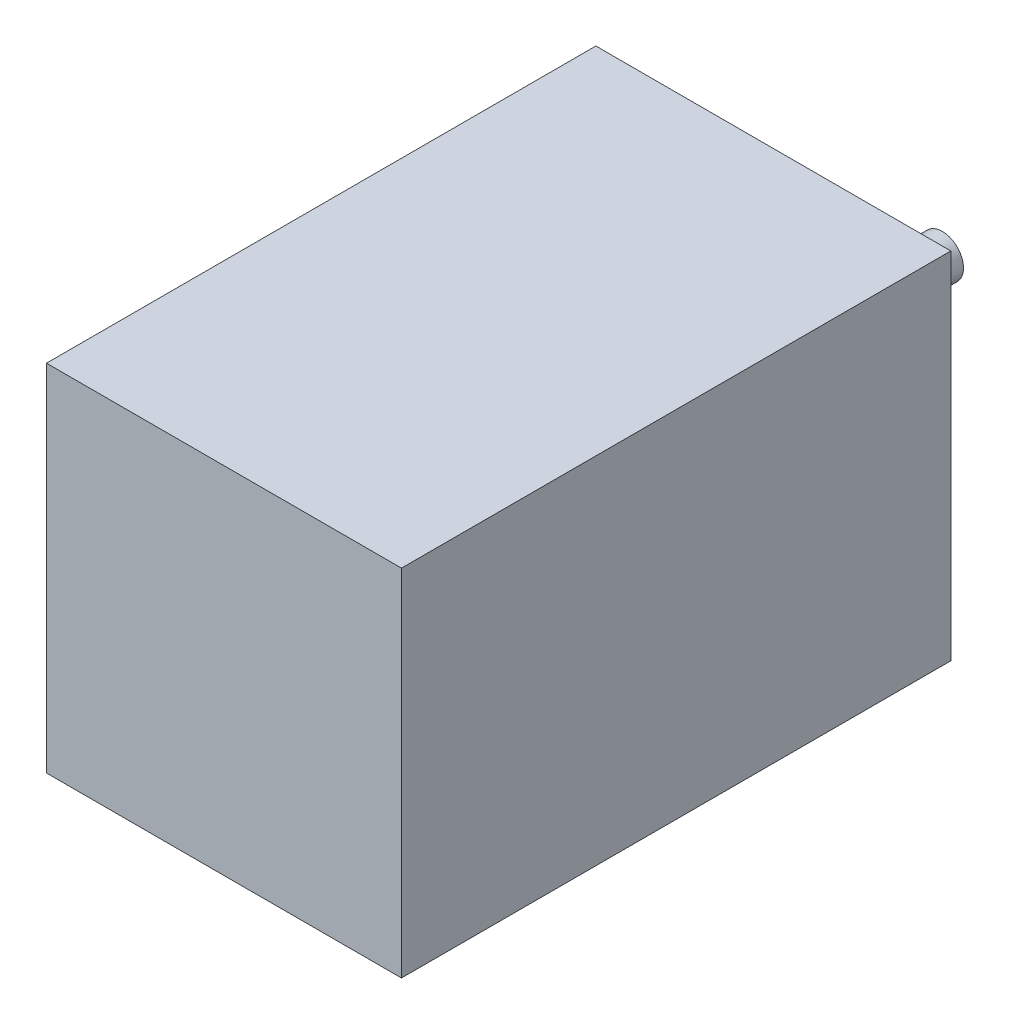
ISO-10303-21;
HEADER;
FILE_DESCRIPTION(('STEP AP214'),'2;1');
FILE_NAME('part.step','',(''),(''),'','','');
FILE_SCHEMA(('AUTOMOTIVE_DESIGN { 1 0 10303 214 1 1 1 1 }'));
ENDSEC;
DATA;
#1=APPLICATION_CONTEXT('core data for automotive mechanical design processes');
#2=APPLICATION_PROTOCOL_DEFINITION('international standard','automotive_design',2000,#1);
#3=PRODUCT_CONTEXT('',#1,'mechanical');
#4=PRODUCT('Part','Part','',(#3));
#5=PRODUCT_RELATED_PRODUCT_CATEGORY('part','',(#4));
#6=PRODUCT_DEFINITION_FORMATION('','',#4);
#7=PRODUCT_DEFINITION_CONTEXT('part definition',#1,'design');
#8=PRODUCT_DEFINITION('design','',#6,#7);
#9=PRODUCT_DEFINITION_SHAPE('','',#8);
#10=(LENGTH_UNIT() NAMED_UNIT(*) SI_UNIT(.MILLI.,.METRE.));
#11=(NAMED_UNIT(*) PLANE_ANGLE_UNIT() SI_UNIT($,.RADIAN.));
#12=(NAMED_UNIT(*) SI_UNIT($,.STERADIAN.) SOLID_ANGLE_UNIT());
#13=UNCERTAINTY_MEASURE_WITH_UNIT(LENGTH_MEASURE(1.E-05),#10,'distance_accuracy_value','');
#14=(GEOMETRIC_REPRESENTATION_CONTEXT(3) GLOBAL_UNCERTAINTY_ASSIGNED_CONTEXT((#13)) GLOBAL_UNIT_ASSIGNED_CONTEXT((#10,
#11,#12)) REPRESENTATION_CONTEXT('',''));
#15=CARTESIAN_POINT('',(0.,0.,0.));
#16=DIRECTION('',(0.,0.,1.));
#17=DIRECTION('',(1.,0.,0.));
#18=AXIS2_PLACEMENT_3D('',#15,#16,#17);
#19=CARTESIAN_POINT('',(0.,0.,-20.));
#20=DIRECTION('',(0.,0.,1.));
#21=DIRECTION('',(1.,0.,0.));
#22=AXIS2_PLACEMENT_3D('',#19,#20,#21);
#23=PLANE('',#22);
#24=CARTESIAN_POINT('',(0.,0.,-20.));
#25=DIRECTION('',(0.,0.,1.));
#26=DIRECTION('',(1.,0.,0.));
#27=AXIS2_PLACEMENT_3D('',#24,#25,#26);
#28=CIRCLE('',#27,2.5);
#29=CARTESIAN_POINT('',(2.5,0.,-20.));
#30=VERTEX_POINT('',#29);
#31=EDGE_CURVE('E10',#30,#30,#28,.T.);
#32=ORIENTED_EDGE('',*,*,#31,.F.);
#33=EDGE_LOOP('',(#32));
#34=FACE_BOUND('',#33,.T.);
#35=ADVANCED_FACE('F16',(#34),#23,.F.);
#36=CARTESIAN_POINT('',(0.,0.,-20.));
#37=DIRECTION('',(0.,0.,1.));
#38=DIRECTION('',(1.,0.,0.));
#39=AXIS2_PLACEMENT_3D('',#36,#37,#38);
#40=CYLINDRICAL_SURFACE('',#39,2.5);
#41=CARTESIAN_POINT('',(0.,0.,0.));
#42=DIRECTION('',(0.,0.,1.));
#43=DIRECTION('',(1.,0.,0.));
#44=AXIS2_PLACEMENT_3D('',#41,#42,#43);
#45=CIRCLE('',#44,2.5);
#46=CARTESIAN_POINT('',(2.5,0.,0.));
#47=VERTEX_POINT('',#46);
#48=EDGE_CURVE('E25',#47,#47,#45,.T.);
#49=ORIENTED_EDGE('',*,*,#48,.F.);
#50=EDGE_LOOP('',(#49));
#51=FACE_BOUND('',#50,.T.);
#52=ORIENTED_EDGE('',*,*,#31,.T.);
#53=EDGE_LOOP('',(#52));
#54=FACE_BOUND('',#53,.T.);
#55=ADVANCED_FACE('F18',(#51,#54),#40,.T.);
#56=CARTESIAN_POINT('',(21.,-21.,0.));
#57=DIRECTION('',(1.,0.,0.));
#58=DIRECTION('',(0.,1.,0.));
#59=AXIS2_PLACEMENT_3D('',#56,#57,#58);
#60=PLANE('',#59);
#61=DIRECTION('',(0.,0.,1.));
#62=VECTOR('',#61,1.);
#63=CARTESIAN_POINT('',(21.,-21.,0.));
#64=LINE('',#63,#62);
#65=CARTESIAN_POINT('',(21.,-21.,0.));
#66=VERTEX_POINT('',#65);
#67=CARTESIAN_POINT('',(21.,-21.,65.));
#68=VERTEX_POINT('',#67);
#69=EDGE_CURVE('E77',#66,#68,#64,.T.);
#70=ORIENTED_EDGE('',*,*,#69,.F.);
#71=DIRECTION('',(0.,1.,0.));
#72=VECTOR('',#71,1.);
#73=CARTESIAN_POINT('',(21.,-21.,0.));
#74=LINE('',#73,#72);
#75=CARTESIAN_POINT('',(21.,21.,0.));
#76=VERTEX_POINT('',#75);
#77=EDGE_CURVE('E37',#66,#76,#74,.T.);
#78=ORIENTED_EDGE('',*,*,#77,.T.);
#79=DIRECTION('',(0.,0.,1.));
#80=VECTOR('',#79,1.);
#81=CARTESIAN_POINT('',(21.,21.,0.));
#82=LINE('',#81,#80);
#83=CARTESIAN_POINT('',(21.,21.,65.));
#84=VERTEX_POINT('',#83);
#85=EDGE_CURVE('E43',#76,#84,#82,.T.);
#86=ORIENTED_EDGE('',*,*,#85,.T.);
#87=DIRECTION('',(0.,1.,0.));
#88=VECTOR('',#87,1.);
#89=CARTESIAN_POINT('',(21.,-21.,65.));
#90=LINE('',#89,#88);
#91=EDGE_CURVE('E112',#68,#84,#90,.T.);
#92=ORIENTED_EDGE('',*,*,#91,.F.);
#93=EDGE_LOOP('',(#70,#78,#86,#92));
#94=FACE_BOUND('',#93,.T.);
#95=ADVANCED_FACE('F131',(#94),#60,.T.);
#96=CARTESIAN_POINT('',(-21.,-21.,0.));
#97=DIRECTION('',(0.,0.,1.));
#98=DIRECTION('',(1.,0.,0.));
#99=AXIS2_PLACEMENT_3D('',#96,#97,#98);
#100=PLANE('',#99);
#101=ORIENTED_EDGE('',*,*,#48,.T.);
#102=EDGE_LOOP('',(#101));
#103=FACE_BOUND('',#102,.T.);
#104=DIRECTION('',(1.,0.,0.));
#105=VECTOR('',#104,1.);
#106=CARTESIAN_POINT('',(-21.,21.,0.));
#107=LINE('',#106,#105);
#108=CARTESIAN_POINT('',(-21.,21.,0.));
#109=VERTEX_POINT('',#108);
#110=EDGE_CURVE('E104',#109,#76,#107,.T.);
#111=ORIENTED_EDGE('',*,*,#110,.T.);
#112=ORIENTED_EDGE('',*,*,#77,.F.);
#113=DIRECTION('',(1.,0.,0.));
#114=VECTOR('',#113,1.);
#115=CARTESIAN_POINT('',(-21.,-21.,0.));
#116=LINE('',#115,#114);
#117=CARTESIAN_POINT('',(-21.,-21.,0.));
#118=VERTEX_POINT('',#117);
#119=EDGE_CURVE('E82',#118,#66,#116,.T.);
#120=ORIENTED_EDGE('',*,*,#119,.F.);
#121=DIRECTION('',(0.,1.,0.));
#122=VECTOR('',#121,1.);
#123=CARTESIAN_POINT('',(-21.,-21.,0.));
#124=LINE('',#123,#122);
#125=EDGE_CURVE('E90',#118,#109,#124,.T.);
#126=ORIENTED_EDGE('',*,*,#125,.T.);
#127=EDGE_LOOP('',(#111,#112,#120,#126));
#128=FACE_BOUND('',#127,.T.);
#129=ADVANCED_FACE('F126',(#103,#128),#100,.F.);
#130=CARTESIAN_POINT('',(-21.,21.,0.));
#131=DIRECTION('',(0.,1.,0.));
#132=DIRECTION('',(1.,0.,0.));
#133=AXIS2_PLACEMENT_3D('',#130,#131,#132);
#134=PLANE('',#133);
#135=ORIENTED_EDGE('',*,*,#110,.F.);
#136=DIRECTION('',(0.,0.,1.));
#137=VECTOR('',#136,1.);
#138=CARTESIAN_POINT('',(-21.,21.,0.));
#139=LINE('',#138,#137);
#140=CARTESIAN_POINT('',(-21.,21.,65.));
#141=VERTEX_POINT('',#140);
#142=EDGE_CURVE('E97',#109,#141,#139,.T.);
#143=ORIENTED_EDGE('',*,*,#142,.T.);
#144=DIRECTION('',(1.,0.,0.));
#145=VECTOR('',#144,1.);
#146=CARTESIAN_POINT('',(-21.,21.,65.));
#147=LINE('',#146,#145);
#148=EDGE_CURVE('E94',#141,#84,#147,.T.);
#149=ORIENTED_EDGE('',*,*,#148,.T.);
#150=ORIENTED_EDGE('',*,*,#85,.F.);
#151=EDGE_LOOP('',(#135,#143,#149,#150));
#152=FACE_BOUND('',#151,.T.);
#153=ADVANCED_FACE('F141',(#152),#134,.T.);
#154=CARTESIAN_POINT('',(-21.,-21.,65.));
#155=DIRECTION('',(0.,0.,1.));
#156=DIRECTION('',(1.,0.,0.));
#157=AXIS2_PLACEMENT_3D('',#154,#155,#156);
#158=PLANE('',#157);
#159=DIRECTION('',(0.,1.,0.));
#160=VECTOR('',#159,1.);
#161=CARTESIAN_POINT('',(-21.,-21.,65.));
#162=LINE('',#161,#160);
#163=CARTESIAN_POINT('',(-21.,-21.,65.));
#164=VERTEX_POINT('',#163);
#165=EDGE_CURVE('E88',#164,#141,#162,.T.);
#166=ORIENTED_EDGE('',*,*,#165,.F.);
#167=DIRECTION('',(1.,0.,0.));
#168=VECTOR('',#167,1.);
#169=CARTESIAN_POINT('',(-21.,-21.,65.));
#170=LINE('',#169,#168);
#171=EDGE_CURVE('E71',#164,#68,#170,.T.);
#172=ORIENTED_EDGE('',*,*,#171,.T.);
#173=ORIENTED_EDGE('',*,*,#91,.T.);
#174=ORIENTED_EDGE('',*,*,#148,.F.);
#175=EDGE_LOOP('',(#166,#172,#173,#174));
#176=FACE_BOUND('',#175,.T.);
#177=ADVANCED_FACE('F93',(#176),#158,.T.);
#178=CARTESIAN_POINT('',(-21.,-21.,0.));
#179=DIRECTION('',(0.,1.,0.));
#180=DIRECTION('',(1.,0.,0.));
#181=AXIS2_PLACEMENT_3D('',#178,#179,#180);
#182=PLANE('',#181);
#183=ORIENTED_EDGE('',*,*,#69,.T.);
#184=ORIENTED_EDGE('',*,*,#171,.F.);
#185=DIRECTION('',(0.,0.,1.));
#186=VECTOR('',#185,1.);
#187=CARTESIAN_POINT('',(-21.,-21.,0.));
#188=LINE('',#187,#186);
#189=EDGE_CURVE('E75',#118,#164,#188,.T.);
#190=ORIENTED_EDGE('',*,*,#189,.F.);
#191=ORIENTED_EDGE('',*,*,#119,.T.);
#192=EDGE_LOOP('',(#183,#184,#190,#191));
#193=FACE_BOUND('',#192,.T.);
#194=ADVANCED_FACE('F73',(#193),#182,.F.);
#195=CARTESIAN_POINT('',(-21.,-21.,0.));
#196=DIRECTION('',(1.,0.,0.));
#197=DIRECTION('',(0.,1.,0.));
#198=AXIS2_PLACEMENT_3D('',#195,#196,#197);
#199=PLANE('',#198);
#200=ORIENTED_EDGE('',*,*,#165,.T.);
#201=ORIENTED_EDGE('',*,*,#142,.F.);
#202=ORIENTED_EDGE('',*,*,#125,.F.);
#203=ORIENTED_EDGE('',*,*,#189,.T.);
#204=EDGE_LOOP('',(#200,#201,#202,#203));
#205=FACE_BOUND('',#204,.T.);
#206=ADVANCED_FACE('F86',(#205),#199,.F.);
#207=CLOSED_SHELL('',(#35,#55,#95,#129,#153,#177,#194,#206));
#208=MANIFOLD_SOLID_BREP('B1',#207);
#209=ADVANCED_BREP_SHAPE_REPRESENTATION('',(#18,#208),#14);
#210=SHAPE_DEFINITION_REPRESENTATION(#9,#209);
ENDSEC;
END-ISO-10303-21;
